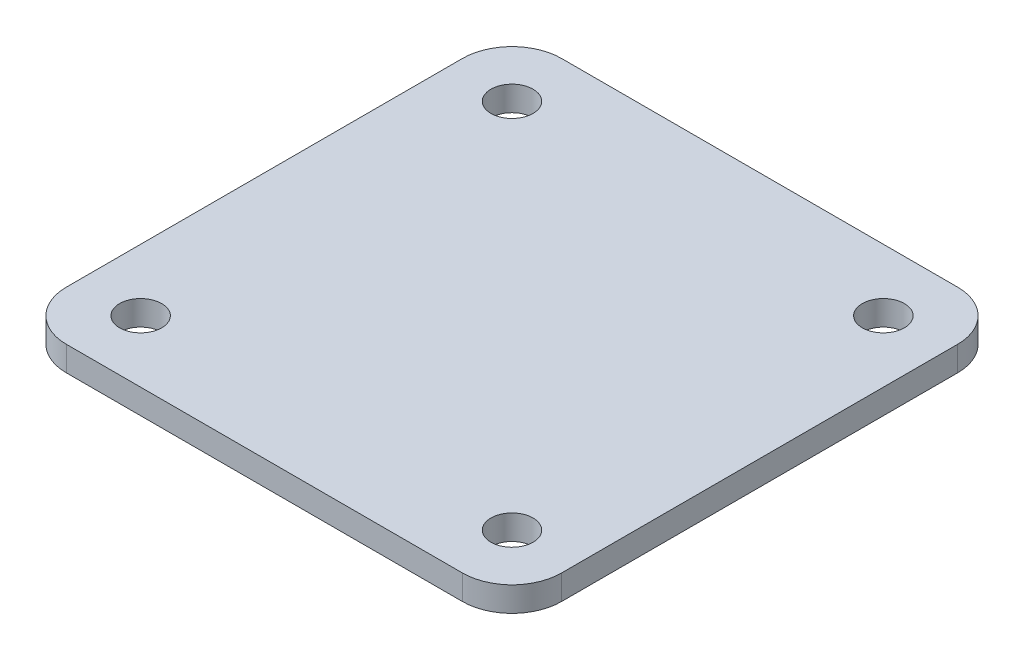
ISO-10303-21;
HEADER;
FILE_DESCRIPTION(('STEP AP214'),'2;1');
FILE_NAME('part.step','',(''),(''),'','','');
FILE_SCHEMA(('AUTOMOTIVE_DESIGN { 1 0 10303 214 1 1 1 1 }'));
ENDSEC;
DATA;
#1=APPLICATION_CONTEXT('core data for automotive mechanical design processes');
#2=APPLICATION_PROTOCOL_DEFINITION('international standard','automotive_design',2000,#1);
#3=PRODUCT_CONTEXT('',#1,'mechanical');
#4=PRODUCT('Part','Part','',(#3));
#5=PRODUCT_RELATED_PRODUCT_CATEGORY('part','',(#4));
#6=PRODUCT_DEFINITION_FORMATION('','',#4);
#7=PRODUCT_DEFINITION_CONTEXT('part definition',#1,'design');
#8=PRODUCT_DEFINITION('design','',#6,#7);
#9=PRODUCT_DEFINITION_SHAPE('','',#8);
#10=(LENGTH_UNIT() NAMED_UNIT(*) SI_UNIT(.MILLI.,.METRE.));
#11=(NAMED_UNIT(*) PLANE_ANGLE_UNIT() SI_UNIT($,.RADIAN.));
#12=(NAMED_UNIT(*) SI_UNIT($,.STERADIAN.) SOLID_ANGLE_UNIT());
#13=UNCERTAINTY_MEASURE_WITH_UNIT(LENGTH_MEASURE(1.E-05),#10,'distance_accuracy_value','');
#14=(GEOMETRIC_REPRESENTATION_CONTEXT(3) GLOBAL_UNCERTAINTY_ASSIGNED_CONTEXT((#13)) GLOBAL_UNIT_ASSIGNED_CONTEXT((#10,
#11,#12)) REPRESENTATION_CONTEXT('',''));
#15=CARTESIAN_POINT('',(0.,0.,0.));
#16=DIRECTION('',(0.,0.,1.));
#17=DIRECTION('',(1.,0.,0.));
#18=AXIS2_PLACEMENT_3D('',#15,#16,#17);
#19=CARTESIAN_POINT('',(0.,2.,0.));
#20=DIRECTION('',(0.,1.,0.));
#21=DIRECTION('',(0.,0.,1.));
#22=AXIS2_PLACEMENT_3D('',#19,#20,#21);
#23=PLANE('',#22);
#24=CARTESIAN_POINT('',(-15.,2.,15.));
#25=DIRECTION('',(0.,1.,0.));
#26=DIRECTION('',(0.,0.,1.));
#27=AXIS2_PLACEMENT_3D('',#24,#25,#26);
#28=CIRCLE('',#27,1.7);
#29=CARTESIAN_POINT('',(-15.,2.,16.7));
#30=VERTEX_POINT('',#29);
#31=EDGE_CURVE('E188',#30,#30,#28,.T.);
#32=ORIENTED_EDGE('',*,*,#31,.F.);
#33=EDGE_LOOP('',(#32));
#34=FACE_BOUND('',#33,.T.);
#35=CARTESIAN_POINT('',(15.,2.,-15.));
#36=DIRECTION('',(0.,1.,0.));
#37=DIRECTION('',(0.,0.,1.));
#38=AXIS2_PLACEMENT_3D('',#35,#36,#37);
#39=CIRCLE('',#38,1.7);
#40=CARTESIAN_POINT('',(15.,2.,-13.3));
#41=VERTEX_POINT('',#40);
#42=EDGE_CURVE('E178',#41,#41,#39,.T.);
#43=ORIENTED_EDGE('',*,*,#42,.F.);
#44=EDGE_LOOP('',(#43));
#45=FACE_BOUND('',#44,.T.);
#46=DIRECTION('',(-1.,0.,0.));
#47=VECTOR('',#46,1.);
#48=CARTESIAN_POINT('',(-20.,2.,-20.));
#49=LINE('',#48,#47);
#50=CARTESIAN_POINT('',(16.,2.,-20.));
#51=VERTEX_POINT('',#50);
#52=CARTESIAN_POINT('',(-16.,2.,-20.));
#53=VERTEX_POINT('',#52);
#54=EDGE_CURVE('E169',#51,#53,#49,.T.);
#55=ORIENTED_EDGE('',*,*,#54,.T.);
#56=CARTESIAN_POINT('',(-16.,2.,-16.));
#57=DIRECTION('',(0.,1.,0.));
#58=DIRECTION('',(0.,0.,1.));
#59=AXIS2_PLACEMENT_3D('',#56,#57,#58);
#60=CIRCLE('',#59,4.);
#61=CARTESIAN_POINT('',(-20.,2.,-16.));
#62=VERTEX_POINT('',#61);
#63=EDGE_CURVE('E147',#53,#62,#60,.T.);
#64=ORIENTED_EDGE('',*,*,#63,.T.);
#65=DIRECTION('',(0.,0.,1.));
#66=VECTOR('',#65,1.);
#67=CARTESIAN_POINT('',(-20.,2.,-20.));
#68=LINE('',#67,#66);
#69=CARTESIAN_POINT('',(-20.,2.,16.));
#70=VERTEX_POINT('',#69);
#71=EDGE_CURVE('E117',#62,#70,#68,.T.);
#72=ORIENTED_EDGE('',*,*,#71,.T.);
#73=CARTESIAN_POINT('',(-16.,2.,16.));
#74=DIRECTION('',(0.,1.,0.));
#75=DIRECTION('',(0.,0.,1.));
#76=AXIS2_PLACEMENT_3D('',#73,#74,#75);
#77=CIRCLE('',#76,4.);
#78=CARTESIAN_POINT('',(-16.,2.,20.));
#79=VERTEX_POINT('',#78);
#80=EDGE_CURVE('E53',#70,#79,#77,.T.);
#81=ORIENTED_EDGE('',*,*,#80,.T.);
#82=DIRECTION('',(1.,0.,0.));
#83=VECTOR('',#82,1.);
#84=CARTESIAN_POINT('',(-20.,2.,20.));
#85=LINE('',#84,#83);
#86=CARTESIAN_POINT('',(16.,2.,20.));
#87=VERTEX_POINT('',#86);
#88=EDGE_CURVE('E133',#79,#87,#85,.T.);
#89=ORIENTED_EDGE('',*,*,#88,.T.);
#90=CARTESIAN_POINT('',(16.,2.,16.));
#91=DIRECTION('',(0.,1.,0.));
#92=DIRECTION('',(0.,0.,1.));
#93=AXIS2_PLACEMENT_3D('',#90,#91,#92);
#94=CIRCLE('',#93,4.);
#95=CARTESIAN_POINT('',(20.,2.,16.));
#96=VERTEX_POINT('',#95);
#97=EDGE_CURVE('E143',#87,#96,#94,.T.);
#98=ORIENTED_EDGE('',*,*,#97,.T.);
#99=DIRECTION('',(0.,0.,-1.));
#100=VECTOR('',#99,1.);
#101=CARTESIAN_POINT('',(20.,2.,-20.));
#102=LINE('',#101,#100);
#103=CARTESIAN_POINT('',(20.,2.,-16.));
#104=VERTEX_POINT('',#103);
#105=EDGE_CURVE('E127',#96,#104,#102,.T.);
#106=ORIENTED_EDGE('',*,*,#105,.T.);
#107=CARTESIAN_POINT('',(16.,2.,-16.));
#108=DIRECTION('',(0.,1.,0.));
#109=DIRECTION('',(0.,0.,1.));
#110=AXIS2_PLACEMENT_3D('',#107,#108,#109);
#111=CIRCLE('',#110,4.);
#112=EDGE_CURVE('E145',#104,#51,#111,.T.);
#113=ORIENTED_EDGE('',*,*,#112,.T.);
#114=EDGE_LOOP('',(#55,#64,#72,#81,#89,#98,#106,#113));
#115=FACE_BOUND('',#114,.T.);
#116=CARTESIAN_POINT('',(-15.,2.,-15.));
#117=DIRECTION('',(0.,1.,0.));
#118=DIRECTION('',(0.,0.,1.));
#119=AXIS2_PLACEMENT_3D('',#116,#117,#118);
#120=CIRCLE('',#119,1.7);
#121=CARTESIAN_POINT('',(-15.,2.,-13.3));
#122=VERTEX_POINT('',#121);
#123=EDGE_CURVE('E183',#122,#122,#120,.T.);
#124=ORIENTED_EDGE('',*,*,#123,.F.);
#125=EDGE_LOOP('',(#124));
#126=FACE_BOUND('',#125,.T.);
#127=CARTESIAN_POINT('',(15.,2.,15.));
#128=DIRECTION('',(0.,1.,0.));
#129=DIRECTION('',(0.,0.,1.));
#130=AXIS2_PLACEMENT_3D('',#127,#128,#129);
#131=CIRCLE('',#130,1.7);
#132=CARTESIAN_POINT('',(15.,2.,16.7));
#133=VERTEX_POINT('',#132);
#134=EDGE_CURVE('E194',#133,#133,#131,.T.);
#135=ORIENTED_EDGE('',*,*,#134,.F.);
#136=EDGE_LOOP('',(#135));
#137=FACE_BOUND('',#136,.T.);
#138=ADVANCED_FACE('F33',(#34,#45,#115,#126,#137),#23,.T.);
#139=CARTESIAN_POINT('',(0.,0.,0.));
#140=DIRECTION('',(0.,1.,0.));
#141=DIRECTION('',(0.,0.,1.));
#142=AXIS2_PLACEMENT_3D('',#139,#140,#141);
#143=PLANE('',#142);
#144=DIRECTION('',(0.,0.,1.));
#145=VECTOR('',#144,1.);
#146=CARTESIAN_POINT('',(-20.,0.,-20.));
#147=LINE('',#146,#145);
#148=CARTESIAN_POINT('',(-20.,0.,-16.));
#149=VERTEX_POINT('',#148);
#150=CARTESIAN_POINT('',(-20.,0.,16.));
#151=VERTEX_POINT('',#150);
#152=EDGE_CURVE('E115',#149,#151,#147,.T.);
#153=ORIENTED_EDGE('',*,*,#152,.F.);
#154=CARTESIAN_POINT('',(-16.,0.,-16.));
#155=DIRECTION('',(0.,1.,0.));
#156=DIRECTION('',(0.,0.,1.));
#157=AXIS2_PLACEMENT_3D('',#154,#155,#156);
#158=CIRCLE('',#157,4.);
#159=CARTESIAN_POINT('',(-16.,0.,-20.));
#160=VERTEX_POINT('',#159);
#161=EDGE_CURVE('E98',#149,#160,#158,.F.);
#162=ORIENTED_EDGE('',*,*,#161,.T.);
#163=DIRECTION('',(-1.,0.,0.));
#164=VECTOR('',#163,1.);
#165=CARTESIAN_POINT('',(-20.,0.,-20.));
#166=LINE('',#165,#164);
#167=CARTESIAN_POINT('',(16.,0.,-20.));
#168=VERTEX_POINT('',#167);
#169=EDGE_CURVE('E125',#168,#160,#166,.T.);
#170=ORIENTED_EDGE('',*,*,#169,.F.);
#171=CARTESIAN_POINT('',(16.,0.,-16.));
#172=DIRECTION('',(0.,1.,0.));
#173=DIRECTION('',(0.,0.,1.));
#174=AXIS2_PLACEMENT_3D('',#171,#172,#173);
#175=CIRCLE('',#174,4.);
#176=CARTESIAN_POINT('',(20.,0.,-16.));
#177=VERTEX_POINT('',#176);
#178=EDGE_CURVE('E109',#168,#177,#175,.F.);
#179=ORIENTED_EDGE('',*,*,#178,.T.);
#180=DIRECTION('',(0.,0.,-1.));
#181=VECTOR('',#180,1.);
#182=CARTESIAN_POINT('',(20.,0.,-20.));
#183=LINE('',#182,#181);
#184=CARTESIAN_POINT('',(20.,0.,16.));
#185=VERTEX_POINT('',#184);
#186=EDGE_CURVE('E129',#185,#177,#183,.T.);
#187=ORIENTED_EDGE('',*,*,#186,.F.);
#188=CARTESIAN_POINT('',(16.,0.,16.));
#189=DIRECTION('',(0.,1.,0.));
#190=DIRECTION('',(0.,0.,1.));
#191=AXIS2_PLACEMENT_3D('',#188,#189,#190);
#192=CIRCLE('',#191,4.);
#193=CARTESIAN_POINT('',(16.,0.,20.));
#194=VERTEX_POINT('',#193);
#195=EDGE_CURVE('E136',#185,#194,#192,.F.);
#196=ORIENTED_EDGE('',*,*,#195,.T.);
#197=DIRECTION('',(1.,0.,0.));
#198=VECTOR('',#197,1.);
#199=CARTESIAN_POINT('',(-20.,0.,20.));
#200=LINE('',#199,#198);
#201=CARTESIAN_POINT('',(-16.,0.,20.));
#202=VERTEX_POINT('',#201);
#203=EDGE_CURVE('E124',#202,#194,#200,.T.);
#204=ORIENTED_EDGE('',*,*,#203,.F.);
#205=CARTESIAN_POINT('',(-16.,0.,16.));
#206=DIRECTION('',(0.,1.,0.));
#207=DIRECTION('',(0.,0.,1.));
#208=AXIS2_PLACEMENT_3D('',#205,#206,#207);
#209=CIRCLE('',#208,4.);
#210=EDGE_CURVE('E118',#202,#151,#209,.F.);
#211=ORIENTED_EDGE('',*,*,#210,.T.);
#212=EDGE_LOOP('',(#153,#162,#170,#179,#187,#196,#204,#211));
#213=FACE_BOUND('',#212,.T.);
#214=CARTESIAN_POINT('',(15.,0.,-15.));
#215=DIRECTION('',(0.,1.,0.));
#216=DIRECTION('',(0.,0.,1.));
#217=AXIS2_PLACEMENT_3D('',#214,#215,#216);
#218=CIRCLE('',#217,1.7);
#219=CARTESIAN_POINT('',(15.,0.,-13.3));
#220=VERTEX_POINT('',#219);
#221=EDGE_CURVE('E174',#220,#220,#218,.T.);
#222=ORIENTED_EDGE('',*,*,#221,.T.);
#223=EDGE_LOOP('',(#222));
#224=FACE_BOUND('',#223,.T.);
#225=CARTESIAN_POINT('',(-15.,0.,-15.));
#226=DIRECTION('',(0.,1.,0.));
#227=DIRECTION('',(0.,0.,1.));
#228=AXIS2_PLACEMENT_3D('',#225,#226,#227);
#229=CIRCLE('',#228,1.7);
#230=CARTESIAN_POINT('',(-15.,0.,-13.3));
#231=VERTEX_POINT('',#230);
#232=EDGE_CURVE('E185',#231,#231,#229,.T.);
#233=ORIENTED_EDGE('',*,*,#232,.T.);
#234=EDGE_LOOP('',(#233));
#235=FACE_BOUND('',#234,.T.);
#236=CARTESIAN_POINT('',(-15.,0.,15.));
#237=DIRECTION('',(0.,1.,0.));
#238=DIRECTION('',(0.,0.,1.));
#239=AXIS2_PLACEMENT_3D('',#236,#237,#238);
#240=CIRCLE('',#239,1.7);
#241=CARTESIAN_POINT('',(-15.,0.,16.7));
#242=VERTEX_POINT('',#241);
#243=EDGE_CURVE('E191',#242,#242,#240,.T.);
#244=ORIENTED_EDGE('',*,*,#243,.T.);
#245=EDGE_LOOP('',(#244));
#246=FACE_BOUND('',#245,.T.);
#247=CARTESIAN_POINT('',(15.,0.,15.));
#248=DIRECTION('',(0.,1.,0.));
#249=DIRECTION('',(0.,0.,1.));
#250=AXIS2_PLACEMENT_3D('',#247,#248,#249);
#251=CIRCLE('',#250,1.7);
#252=CARTESIAN_POINT('',(15.,0.,16.7));
#253=VERTEX_POINT('',#252);
#254=EDGE_CURVE('E197',#253,#253,#251,.T.);
#255=ORIENTED_EDGE('',*,*,#254,.T.);
#256=EDGE_LOOP('',(#255));
#257=FACE_BOUND('',#256,.T.);
#258=ADVANCED_FACE('F121',(#213,#224,#235,#246,#257),#143,.F.);
#259=CARTESIAN_POINT('',(20.,2.,-20.));
#260=DIRECTION('',(-1.,0.,0.));
#261=DIRECTION('',(0.,0.,1.));
#262=AXIS2_PLACEMENT_3D('',#259,#260,#261);
#263=PLANE('',#262);
#264=ORIENTED_EDGE('',*,*,#186,.T.);
#265=DIRECTION('',(0.,-1.,0.));
#266=VECTOR('',#265,1.);
#267=CARTESIAN_POINT('',(20.,2.,-16.));
#268=LINE('',#267,#266);
#269=EDGE_CURVE('E152',#177,#104,#268,.F.);
#270=ORIENTED_EDGE('',*,*,#269,.T.);
#271=ORIENTED_EDGE('',*,*,#105,.F.);
#272=DIRECTION('',(0.,-1.,0.));
#273=VECTOR('',#272,1.);
#274=CARTESIAN_POINT('',(20.,2.,16.));
#275=LINE('',#274,#273);
#276=EDGE_CURVE('E149',#96,#185,#275,.T.);
#277=ORIENTED_EDGE('',*,*,#276,.T.);
#278=EDGE_LOOP('',(#264,#270,#271,#277));
#279=FACE_BOUND('',#278,.T.);
#280=ADVANCED_FACE('F165',(#279),#263,.F.);
#281=CARTESIAN_POINT('',(-20.,2.,-20.));
#282=DIRECTION('',(0.,0.,1.));
#283=DIRECTION('',(1.,0.,0.));
#284=AXIS2_PLACEMENT_3D('',#281,#282,#283);
#285=PLANE('',#284);
#286=ORIENTED_EDGE('',*,*,#169,.T.);
#287=DIRECTION('',(0.,-1.,0.));
#288=VECTOR('',#287,1.);
#289=CARTESIAN_POINT('',(-16.,2.,-20.));
#290=LINE('',#289,#288);
#291=EDGE_CURVE('E103',#160,#53,#290,.F.);
#292=ORIENTED_EDGE('',*,*,#291,.T.);
#293=ORIENTED_EDGE('',*,*,#54,.F.);
#294=DIRECTION('',(0.,-1.,0.));
#295=VECTOR('',#294,1.);
#296=CARTESIAN_POINT('',(16.,2.,-20.));
#297=LINE('',#296,#295);
#298=EDGE_CURVE('E108',#51,#168,#297,.T.);
#299=ORIENTED_EDGE('',*,*,#298,.T.);
#300=EDGE_LOOP('',(#286,#292,#293,#299));
#301=FACE_BOUND('',#300,.T.);
#302=ADVANCED_FACE('F224',(#301),#285,.F.);
#303=CARTESIAN_POINT('',(-20.,2.,-20.));
#304=DIRECTION('',(1.,0.,0.));
#305=DIRECTION('',(0.,0.,-1.));
#306=AXIS2_PLACEMENT_3D('',#303,#304,#305);
#307=PLANE('',#306);
#308=ORIENTED_EDGE('',*,*,#71,.F.);
#309=DIRECTION('',(0.,-1.,0.));
#310=VECTOR('',#309,1.);
#311=CARTESIAN_POINT('',(-20.,2.,-16.));
#312=LINE('',#311,#310);
#313=EDGE_CURVE('E102',#62,#149,#312,.T.);
#314=ORIENTED_EDGE('',*,*,#313,.T.);
#315=ORIENTED_EDGE('',*,*,#152,.T.);
#316=DIRECTION('',(0.,-1.,0.));
#317=VECTOR('',#316,1.);
#318=CARTESIAN_POINT('',(-20.,2.,16.));
#319=LINE('',#318,#317);
#320=EDGE_CURVE('E119',#151,#70,#319,.F.);
#321=ORIENTED_EDGE('',*,*,#320,.T.);
#322=EDGE_LOOP('',(#308,#314,#315,#321));
#323=FACE_BOUND('',#322,.T.);
#324=ADVANCED_FACE('F114',(#323),#307,.F.);
#325=CARTESIAN_POINT('',(-20.,2.,20.));
#326=DIRECTION('',(0.,0.,-1.));
#327=DIRECTION('',(-1.,0.,0.));
#328=AXIS2_PLACEMENT_3D('',#325,#326,#327);
#329=PLANE('',#328);
#330=ORIENTED_EDGE('',*,*,#203,.T.);
#331=DIRECTION('',(0.,-1.,0.));
#332=VECTOR('',#331,1.);
#333=CARTESIAN_POINT('',(16.,2.,20.));
#334=LINE('',#333,#332);
#335=EDGE_CURVE('E11',#194,#87,#334,.F.);
#336=ORIENTED_EDGE('',*,*,#335,.T.);
#337=ORIENTED_EDGE('',*,*,#88,.F.);
#338=DIRECTION('',(0.,-1.,0.));
#339=VECTOR('',#338,1.);
#340=CARTESIAN_POINT('',(-16.,2.,20.));
#341=LINE('',#340,#339);
#342=EDGE_CURVE('E41',#79,#202,#341,.T.);
#343=ORIENTED_EDGE('',*,*,#342,.T.);
#344=EDGE_LOOP('',(#330,#336,#337,#343));
#345=FACE_BOUND('',#344,.T.);
#346=ADVANCED_FACE('F155',(#345),#329,.F.);
#347=CARTESIAN_POINT('',(15.,2.,-15.));
#348=DIRECTION('',(0.,-1.,0.));
#349=DIRECTION('',(0.,0.,-1.));
#350=AXIS2_PLACEMENT_3D('',#347,#348,#349);
#351=CYLINDRICAL_SURFACE('',#350,1.7);
#352=ORIENTED_EDGE('',*,*,#42,.T.);
#353=EDGE_LOOP('',(#352));
#354=FACE_BOUND('',#353,.T.);
#355=ORIENTED_EDGE('',*,*,#221,.F.);
#356=EDGE_LOOP('',(#355));
#357=FACE_BOUND('',#356,.T.);
#358=ADVANCED_FACE('F217',(#354,#357),#351,.F.);
#359=CARTESIAN_POINT('',(-15.,2.,-15.));
#360=DIRECTION('',(0.,-1.,0.));
#361=DIRECTION('',(0.,0.,-1.));
#362=AXIS2_PLACEMENT_3D('',#359,#360,#361);
#363=CYLINDRICAL_SURFACE('',#362,1.7);
#364=ORIENTED_EDGE('',*,*,#123,.T.);
#365=EDGE_LOOP('',(#364));
#366=FACE_BOUND('',#365,.T.);
#367=ORIENTED_EDGE('',*,*,#232,.F.);
#368=EDGE_LOOP('',(#367));
#369=FACE_BOUND('',#368,.T.);
#370=ADVANCED_FACE('F246',(#366,#369),#363,.F.);
#371=CARTESIAN_POINT('',(-15.,2.,15.));
#372=DIRECTION('',(0.,-1.,0.));
#373=DIRECTION('',(0.,0.,-1.));
#374=AXIS2_PLACEMENT_3D('',#371,#372,#373);
#375=CYLINDRICAL_SURFACE('',#374,1.7);
#376=ORIENTED_EDGE('',*,*,#31,.T.);
#377=EDGE_LOOP('',(#376));
#378=FACE_BOUND('',#377,.T.);
#379=ORIENTED_EDGE('',*,*,#243,.F.);
#380=EDGE_LOOP('',(#379));
#381=FACE_BOUND('',#380,.T.);
#382=ADVANCED_FACE('F249',(#378,#381),#375,.F.);
#383=CARTESIAN_POINT('',(15.,2.,15.));
#384=DIRECTION('',(0.,-1.,0.));
#385=DIRECTION('',(0.,0.,-1.));
#386=AXIS2_PLACEMENT_3D('',#383,#384,#385);
#387=CYLINDRICAL_SURFACE('',#386,1.7);
#388=ORIENTED_EDGE('',*,*,#134,.T.);
#389=EDGE_LOOP('',(#388));
#390=FACE_BOUND('',#389,.T.);
#391=ORIENTED_EDGE('',*,*,#254,.F.);
#392=EDGE_LOOP('',(#391));
#393=FACE_BOUND('',#392,.T.);
#394=ADVANCED_FACE('F203',(#390,#393),#387,.F.);
#395=CARTESIAN_POINT('',(-16.,2.,-16.));
#396=DIRECTION('',(0.,-1.,0.));
#397=DIRECTION('',(0.,0.,-1.));
#398=AXIS2_PLACEMENT_3D('',#395,#396,#397);
#399=CYLINDRICAL_SURFACE('',#398,4.);
#400=ORIENTED_EDGE('',*,*,#63,.F.);
#401=ORIENTED_EDGE('',*,*,#291,.F.);
#402=ORIENTED_EDGE('',*,*,#161,.F.);
#403=ORIENTED_EDGE('',*,*,#313,.F.);
#404=EDGE_LOOP('',(#400,#401,#402,#403));
#405=FACE_BOUND('',#404,.T.);
#406=ADVANCED_FACE('F101',(#405),#399,.T.);
#407=CARTESIAN_POINT('',(16.,2.,-16.));
#408=DIRECTION('',(0.,-1.,0.));
#409=DIRECTION('',(0.,0.,-1.));
#410=AXIS2_PLACEMENT_3D('',#407,#408,#409);
#411=CYLINDRICAL_SURFACE('',#410,4.);
#412=ORIENTED_EDGE('',*,*,#112,.F.);
#413=ORIENTED_EDGE('',*,*,#269,.F.);
#414=ORIENTED_EDGE('',*,*,#178,.F.);
#415=ORIENTED_EDGE('',*,*,#298,.F.);
#416=EDGE_LOOP('',(#412,#413,#414,#415));
#417=FACE_BOUND('',#416,.T.);
#418=ADVANCED_FACE('F232',(#417),#411,.T.);
#419=CARTESIAN_POINT('',(16.,2.,16.));
#420=DIRECTION('',(0.,-1.,0.));
#421=DIRECTION('',(0.,0.,-1.));
#422=AXIS2_PLACEMENT_3D('',#419,#420,#421);
#423=CYLINDRICAL_SURFACE('',#422,4.);
#424=ORIENTED_EDGE('',*,*,#97,.F.);
#425=ORIENTED_EDGE('',*,*,#335,.F.);
#426=ORIENTED_EDGE('',*,*,#195,.F.);
#427=ORIENTED_EDGE('',*,*,#276,.F.);
#428=EDGE_LOOP('',(#424,#425,#426,#427));
#429=FACE_BOUND('',#428,.T.);
#430=ADVANCED_FACE('F162',(#429),#423,.T.);
#431=CARTESIAN_POINT('',(-16.,2.,16.));
#432=DIRECTION('',(0.,-1.,0.));
#433=DIRECTION('',(0.,0.,-1.));
#434=AXIS2_PLACEMENT_3D('',#431,#432,#433);
#435=CYLINDRICAL_SURFACE('',#434,4.);
#436=ORIENTED_EDGE('',*,*,#80,.F.);
#437=ORIENTED_EDGE('',*,*,#320,.F.);
#438=ORIENTED_EDGE('',*,*,#210,.F.);
#439=ORIENTED_EDGE('',*,*,#342,.F.);
#440=EDGE_LOOP('',(#436,#437,#438,#439));
#441=FACE_BOUND('',#440,.T.);
#442=ADVANCED_FACE('F35',(#441),#435,.T.);
#443=CLOSED_SHELL('',(#138,#258,#280,#302,#324,#346,#358,#370,#382,#394,#406,#418,#430,#442));
#444=MANIFOLD_SOLID_BREP('B2',#443);
#445=ADVANCED_BREP_SHAPE_REPRESENTATION('',(#18,#444),#14);
#446=SHAPE_DEFINITION_REPRESENTATION(#9,#445);
ENDSEC;
END-ISO-10303-21;
